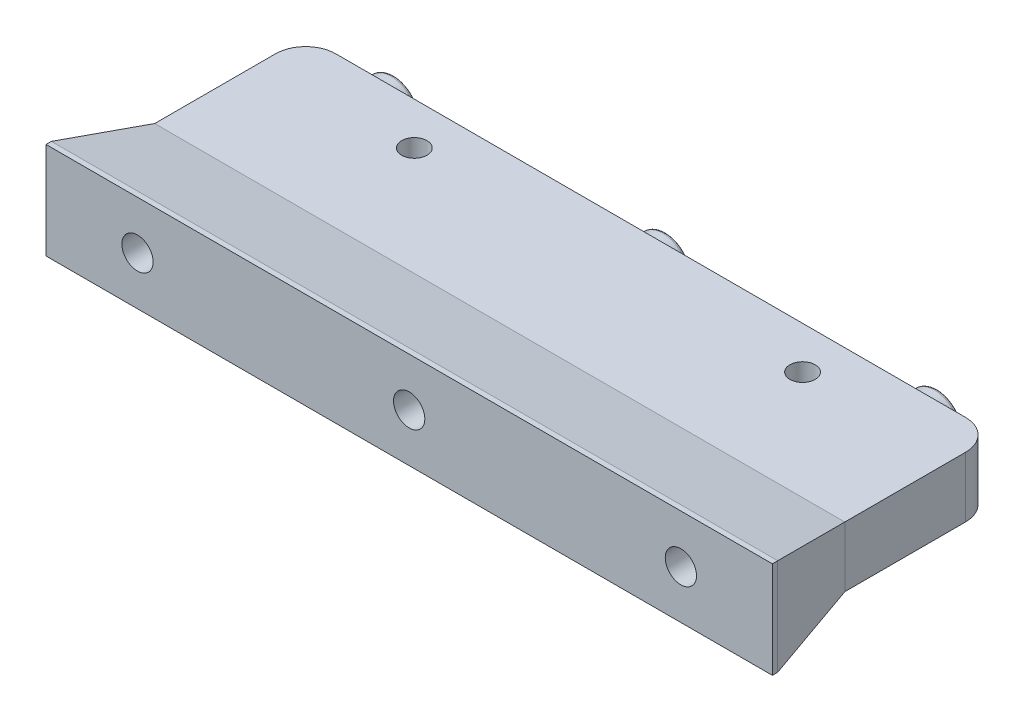
ISO-10303-21;
HEADER;
FILE_DESCRIPTION(('STEP AP214'),'2;1');
FILE_NAME('part.step','',(''),(''),'','','');
FILE_SCHEMA(('AUTOMOTIVE_DESIGN { 1 0 10303 214 1 1 1 1 }'));
ENDSEC;
DATA;
#1=APPLICATION_CONTEXT('core data for automotive mechanical design processes');
#2=APPLICATION_PROTOCOL_DEFINITION('international standard','automotive_design',2000,#1);
#3=PRODUCT_CONTEXT('',#1,'mechanical');
#4=PRODUCT('Part','Part','',(#3));
#5=PRODUCT_RELATED_PRODUCT_CATEGORY('part','',(#4));
#6=PRODUCT_DEFINITION_FORMATION('','',#4);
#7=PRODUCT_DEFINITION_CONTEXT('part definition',#1,'design');
#8=PRODUCT_DEFINITION('design','',#6,#7);
#9=PRODUCT_DEFINITION_SHAPE('','',#8);
#10=(LENGTH_UNIT() NAMED_UNIT(*) SI_UNIT(.MILLI.,.METRE.));
#11=(NAMED_UNIT(*) PLANE_ANGLE_UNIT() SI_UNIT($,.RADIAN.));
#12=(NAMED_UNIT(*) SI_UNIT($,.STERADIAN.) SOLID_ANGLE_UNIT());
#13=UNCERTAINTY_MEASURE_WITH_UNIT(LENGTH_MEASURE(1.E-05),#10,'distance_accuracy_value','');
#14=(GEOMETRIC_REPRESENTATION_CONTEXT(3) GLOBAL_UNCERTAINTY_ASSIGNED_CONTEXT((#13)) GLOBAL_UNIT_ASSIGNED_CONTEXT((#10,
#11,#12)) REPRESENTATION_CONTEXT('',''));
#15=CARTESIAN_POINT('',(0.,0.,0.));
#16=DIRECTION('',(0.,0.,1.));
#17=DIRECTION('',(1.,0.,0.));
#18=AXIS2_PLACEMENT_3D('',#15,#16,#17);
#19=CARTESIAN_POINT('',(57.15,-5.,-7.00000000000001));
#20=DIRECTION('',(0.,0.,-1.));
#21=DIRECTION('',(-1.,0.,0.));
#22=AXIS2_PLACEMENT_3D('',#19,#20,#21);
#23=PLANE('',#22);
#24=CARTESIAN_POINT('',(0.,0.,-7.00000000000001));
#25=DIRECTION('',(0.,0.,-1.));
#26=DIRECTION('',(-1.,0.,0.));
#27=AXIS2_PLACEMENT_3D('',#24,#25,#26);
#28=CIRCLE('',#27,4.85);
#29=CARTESIAN_POINT('',(-4.85,0.,-7.00000000000001));
#30=VERTEX_POINT('',#29);
#31=EDGE_CURVE('E233',#30,#30,#28,.F.);
#32=ORIENTED_EDGE('',*,*,#31,.T.);
#33=EDGE_LOOP('',(#32));
#34=FACE_BOUND('',#33,.T.);
#35=CARTESIAN_POINT('',(-45.,8.88178419700125E-13,-7.));
#36=DIRECTION('',(0.,0.,-1.));
#37=DIRECTION('',(-1.,0.,0.));
#38=AXIS2_PLACEMENT_3D('',#35,#36,#37);
#39=CIRCLE('',#38,4.85000000000001);
#40=CARTESIAN_POINT('',(-49.85,8.88178419700125E-13,-7.));
#41=VERTEX_POINT('',#40);
#42=EDGE_CURVE('E230',#41,#41,#39,.F.);
#43=ORIENTED_EDGE('',*,*,#42,.T.);
#44=EDGE_LOOP('',(#43));
#45=FACE_BOUND('',#44,.T.);
#46=CARTESIAN_POINT('',(45.,4.44089209850063E-13,-7.00000000000001));
#47=DIRECTION('',(0.,0.,-1.));
#48=DIRECTION('',(-1.,0.,0.));
#49=AXIS2_PLACEMENT_3D('',#46,#47,#48);
#50=CIRCLE('',#49,4.85);
#51=CARTESIAN_POINT('',(40.15,4.44089209850063E-13,-7.00000000000001));
#52=VERTEX_POINT('',#51);
#53=EDGE_CURVE('E227',#52,#52,#50,.F.);
#54=ORIENTED_EDGE('',*,*,#53,.T.);
#55=EDGE_LOOP('',(#54));
#56=FACE_BOUND('',#55,.T.);
#57=DIRECTION('',(-1.,0.,0.));
#58=VECTOR('',#57,1.);
#59=CARTESIAN_POINT('',(57.15,5.,-7.00000000000001));
#60=LINE('',#59,#58);
#61=CARTESIAN_POINT('',(52.15,5.,-7.00000000000001));
#62=VERTEX_POINT('',#61);
#63=CARTESIAN_POINT('',(-52.15,5.,-7.));
#64=VERTEX_POINT('',#63);
#65=EDGE_CURVE('E182',#62,#64,#60,.T.);
#66=ORIENTED_EDGE('',*,*,#65,.F.);
#67=DIRECTION('',(0.,1.,0.));
#68=VECTOR('',#67,1.);
#69=CARTESIAN_POINT('',(52.15,-5.,-7.00000000000001));
#70=LINE('',#69,#68);
#71=CARTESIAN_POINT('',(52.15,-5.,-7.00000000000001));
#72=VERTEX_POINT('',#71);
#73=EDGE_CURVE('E210',#62,#72,#70,.F.);
#74=ORIENTED_EDGE('',*,*,#73,.T.);
#75=DIRECTION('',(-1.,0.,0.));
#76=VECTOR('',#75,1.);
#77=CARTESIAN_POINT('',(57.15,-5.,-7.00000000000001));
#78=LINE('',#77,#76);
#79=CARTESIAN_POINT('',(-52.15,-5.,-7.));
#80=VERTEX_POINT('',#79);
#81=EDGE_CURVE('E190',#72,#80,#78,.T.);
#82=ORIENTED_EDGE('',*,*,#81,.T.);
#83=DIRECTION('',(0.,1.,0.));
#84=VECTOR('',#83,1.);
#85=CARTESIAN_POINT('',(-52.15,-5.,-7.));
#86=LINE('',#85,#84);
#87=EDGE_CURVE('E207',#80,#64,#86,.T.);
#88=ORIENTED_EDGE('',*,*,#87,.T.);
#89=EDGE_LOOP('',(#66,#74,#82,#88));
#90=FACE_BOUND('',#89,.T.);
#91=ADVANCED_FACE('F37',(#34,#45,#56,#90),#23,.T.);
#92=CARTESIAN_POINT('',(-57.15,-5.,-5.));
#93=DIRECTION('',(-1.,0.,0.));
#94=DIRECTION('',(0.,0.,1.));
#95=AXIS2_PLACEMENT_3D('',#92,#93,#94);
#96=PLANE('',#95);
#97=DIRECTION('',(0.,0.,1.));
#98=VECTOR('',#97,1.);
#99=CARTESIAN_POINT('',(-57.15,-5.,-7.));
#100=LINE('',#99,#98);
#101=CARTESIAN_POINT('',(-57.15,-5.,-2.));
#102=VERTEX_POINT('',#101);
#103=CARTESIAN_POINT('',(-57.15,-5.,18.));
#104=VERTEX_POINT('',#103);
#105=EDGE_CURVE('E193',#102,#104,#100,.T.);
#106=ORIENTED_EDGE('',*,*,#105,.T.);
#107=DIRECTION('',(0.,1.,0.));
#108=VECTOR('',#107,1.);
#109=CARTESIAN_POINT('',(-57.15,-5.,18.));
#110=LINE('',#109,#108);
#111=CARTESIAN_POINT('',(-57.15,5.,18.));
#112=VERTEX_POINT('',#111);
#113=EDGE_CURVE('E155',#104,#112,#110,.T.);
#114=ORIENTED_EDGE('',*,*,#113,.T.);
#115=DIRECTION('',(0.,0.,1.));
#116=VECTOR('',#115,1.);
#117=CARTESIAN_POINT('',(-57.15,5.,-7.));
#118=LINE('',#117,#116);
#119=CARTESIAN_POINT('',(-57.15,5.,-2.));
#120=VERTEX_POINT('',#119);
#121=EDGE_CURVE('E185',#120,#112,#118,.T.);
#122=ORIENTED_EDGE('',*,*,#121,.F.);
#123=DIRECTION('',(0.,1.,0.));
#124=VECTOR('',#123,1.);
#125=CARTESIAN_POINT('',(-57.15,-5.,-2.));
#126=LINE('',#125,#124);
#127=EDGE_CURVE('E217',#120,#102,#126,.F.);
#128=ORIENTED_EDGE('',*,*,#127,.T.);
#129=EDGE_LOOP('',(#106,#114,#122,#128));
#130=FACE_BOUND('',#129,.T.);
#131=ADVANCED_FACE('F308',(#130),#96,.T.);
#132=CARTESIAN_POINT('',(57.15,-5.,-7.00000000000001));
#133=DIRECTION('',(1.,0.,0.));
#134=DIRECTION('',(0.,0.,-1.));
#135=AXIS2_PLACEMENT_3D('',#132,#133,#134);
#136=PLANE('',#135);
#137=DIRECTION('',(0.,0.,-1.));
#138=VECTOR('',#137,1.);
#139=CARTESIAN_POINT('',(57.15,5.,-5.));
#140=LINE('',#139,#138);
#141=CARTESIAN_POINT('',(57.15,5.,18.));
#142=VERTEX_POINT('',#141);
#143=CARTESIAN_POINT('',(57.15,5.,-2.00000000000001));
#144=VERTEX_POINT('',#143);
#145=EDGE_CURVE('E180',#142,#144,#140,.T.);
#146=ORIENTED_EDGE('',*,*,#145,.F.);
#147=DIRECTION('',(0.,-1.,0.));
#148=VECTOR('',#147,1.);
#149=CARTESIAN_POINT('',(57.15,-5.,18.));
#150=LINE('',#149,#148);
#151=CARTESIAN_POINT('',(57.15,-5.,18.));
#152=VERTEX_POINT('',#151);
#153=EDGE_CURVE('E149',#142,#152,#150,.T.);
#154=ORIENTED_EDGE('',*,*,#153,.T.);
#155=DIRECTION('',(0.,0.,-1.));
#156=VECTOR('',#155,1.);
#157=CARTESIAN_POINT('',(57.15,-5.,-5.));
#158=LINE('',#157,#156);
#159=CARTESIAN_POINT('',(57.15,-5.,-2.00000000000001));
#160=VERTEX_POINT('',#159);
#161=EDGE_CURVE('E188',#152,#160,#158,.T.);
#162=ORIENTED_EDGE('',*,*,#161,.T.);
#163=DIRECTION('',(0.,1.,0.));
#164=VECTOR('',#163,1.);
#165=CARTESIAN_POINT('',(57.15,-5.,-2.00000000000001));
#166=LINE('',#165,#164);
#167=EDGE_CURVE('E196',#160,#144,#166,.T.);
#168=ORIENTED_EDGE('',*,*,#167,.T.);
#169=EDGE_LOOP('',(#146,#154,#162,#168));
#170=FACE_BOUND('',#169,.T.);
#171=ADVANCED_FACE('F314',(#170),#136,.T.);
#172=CARTESIAN_POINT('',(0.,-5.,0.));
#173=DIRECTION('',(0.,1.,0.));
#174=DIRECTION('',(0.,0.,1.));
#175=AXIS2_PLACEMENT_3D('',#172,#173,#174);
#176=PLANE('',#175);
#177=CARTESIAN_POINT('',(32.15,-5.,0.));
#178=DIRECTION('',(0.,-1.,0.));
#179=DIRECTION('',(0.,0.,-1.));
#180=AXIS2_PLACEMENT_3D('',#177,#178,#179);
#181=CIRCLE('',#180,4.7);
#182=CARTESIAN_POINT('',(32.15,-5.,-4.70000000000001));
#183=VERTEX_POINT('',#182);
#184=EDGE_CURVE('E170',#183,#183,#181,.T.);
#185=ORIENTED_EDGE('',*,*,#184,.F.);
#186=EDGE_LOOP('',(#185));
#187=FACE_BOUND('',#186,.T.);
#188=CARTESIAN_POINT('',(-32.15,-5.,0.));
#189=DIRECTION('',(0.,-1.,0.));
#190=DIRECTION('',(0.,0.,-1.));
#191=AXIS2_PLACEMENT_3D('',#188,#189,#190);
#192=CIRCLE('',#191,4.7);
#193=CARTESIAN_POINT('',(-32.15,-5.,-4.69999999999999));
#194=VERTEX_POINT('',#193);
#195=EDGE_CURVE('E163',#194,#194,#192,.T.);
#196=ORIENTED_EDGE('',*,*,#195,.F.);
#197=EDGE_LOOP('',(#196));
#198=FACE_BOUND('',#197,.T.);
#199=DIRECTION('',(1.,0.,0.));
#200=VECTOR('',#199,1.);
#201=CARTESIAN_POINT('',(0.,-5.,18.));
#202=LINE('',#201,#200);
#203=EDGE_CURVE('E157',#104,#152,#202,.T.);
#204=ORIENTED_EDGE('',*,*,#203,.F.);
#205=ORIENTED_EDGE('',*,*,#105,.F.);
#206=CARTESIAN_POINT('',(-52.15,-5.,-2.));
#207=DIRECTION('',(0.,1.,0.));
#208=DIRECTION('',(0.,0.,1.));
#209=AXIS2_PLACEMENT_3D('',#206,#207,#208);
#210=CIRCLE('',#209,5.);
#211=EDGE_CURVE('E212',#102,#80,#210,.F.);
#212=ORIENTED_EDGE('',*,*,#211,.T.);
#213=ORIENTED_EDGE('',*,*,#81,.F.);
#214=CARTESIAN_POINT('',(52.15,-5.,-2.00000000000001));
#215=DIRECTION('',(0.,1.,0.));
#216=DIRECTION('',(0.,0.,1.));
#217=AXIS2_PLACEMENT_3D('',#214,#215,#216);
#218=CIRCLE('',#217,5.);
#219=EDGE_CURVE('E214',#72,#160,#218,.F.);
#220=ORIENTED_EDGE('',*,*,#219,.T.);
#221=ORIENTED_EDGE('',*,*,#161,.F.);
#222=EDGE_LOOP('',(#204,#205,#212,#213,#220,#221));
#223=FACE_BOUND('',#222,.T.);
#224=ADVANCED_FACE('F320',(#187,#198,#223),#176,.F.);
#225=CARTESIAN_POINT('',(0.,5.,0.));
#226=DIRECTION('',(0.,1.,0.));
#227=DIRECTION('',(0.,0.,1.));
#228=AXIS2_PLACEMENT_3D('',#225,#226,#227);
#229=PLANE('',#228);
#230=CARTESIAN_POINT('',(-32.15,5.,0.));
#231=DIRECTION('',(0.,1.,0.));
#232=DIRECTION('',(0.,0.,1.));
#233=AXIS2_PLACEMENT_3D('',#230,#231,#232);
#234=CIRCLE('',#233,2.1);
#235=CARTESIAN_POINT('',(-32.15,5.,2.1));
#236=VERTEX_POINT('',#235);
#237=EDGE_CURVE('E177',#236,#236,#234,.T.);
#238=ORIENTED_EDGE('',*,*,#237,.F.);
#239=EDGE_LOOP('',(#238));
#240=FACE_BOUND('',#239,.T.);
#241=CARTESIAN_POINT('',(32.15,5.,0.));
#242=DIRECTION('',(0.,1.,0.));
#243=DIRECTION('',(0.,0.,-1.));
#244=AXIS2_PLACEMENT_3D('',#241,#242,#243);
#245=CIRCLE('',#244,2.1);
#246=CARTESIAN_POINT('',(32.15,5.,-2.1));
#247=VERTEX_POINT('',#246);
#248=EDGE_CURVE('E174',#247,#247,#245,.T.);
#249=ORIENTED_EDGE('',*,*,#248,.F.);
#250=EDGE_LOOP('',(#249));
#251=FACE_BOUND('',#250,.T.);
#252=ORIENTED_EDGE('',*,*,#121,.T.);
#253=DIRECTION('',(1.,0.,0.));
#254=VECTOR('',#253,1.);
#255=CARTESIAN_POINT('',(0.,5.,18.));
#256=LINE('',#255,#254);
#257=EDGE_CURVE('E219',#112,#142,#256,.T.);
#258=ORIENTED_EDGE('',*,*,#257,.T.);
#259=ORIENTED_EDGE('',*,*,#145,.T.);
#260=CARTESIAN_POINT('',(52.15,5.,-2.00000000000001));
#261=DIRECTION('',(0.,1.,0.));
#262=DIRECTION('',(0.,0.,1.));
#263=AXIS2_PLACEMENT_3D('',#260,#261,#262);
#264=CIRCLE('',#263,5.);
#265=EDGE_CURVE('E205',#144,#62,#264,.T.);
#266=ORIENTED_EDGE('',*,*,#265,.T.);
#267=ORIENTED_EDGE('',*,*,#65,.T.);
#268=CARTESIAN_POINT('',(-52.15,5.,-2.));
#269=DIRECTION('',(0.,1.,0.));
#270=DIRECTION('',(0.,0.,1.));
#271=AXIS2_PLACEMENT_3D('',#268,#269,#270);
#272=CIRCLE('',#271,5.);
#273=EDGE_CURVE('E203',#64,#120,#272,.T.);
#274=ORIENTED_EDGE('',*,*,#273,.T.);
#275=EDGE_LOOP('',(#252,#258,#259,#266,#267,#274));
#276=FACE_BOUND('',#275,.T.);
#277=ADVANCED_FACE('F383',(#240,#251,#276),#229,.T.);
#278=CARTESIAN_POINT('',(-32.15,-5.,0.));
#279=DIRECTION('',(0.,1.,0.));
#280=DIRECTION('',(0.,0.,1.));
#281=AXIS2_PLACEMENT_3D('',#278,#279,#280);
#282=CYLINDRICAL_SURFACE('',#281,2.1);
#283=CARTESIAN_POINT('',(-32.15,-2.55,0.));
#284=DIRECTION('',(0.,1.,0.));
#285=DIRECTION('',(0.,0.,1.));
#286=AXIS2_PLACEMENT_3D('',#283,#284,#285);
#287=CIRCLE('',#286,2.1);
#288=CARTESIAN_POINT('',(-32.15,-2.55,2.1));
#289=VERTEX_POINT('',#288);
#290=EDGE_CURVE('E166',#289,#289,#287,.F.);
#291=ORIENTED_EDGE('',*,*,#290,.T.);
#292=EDGE_LOOP('',(#291));
#293=FACE_BOUND('',#292,.T.);
#294=ORIENTED_EDGE('',*,*,#237,.T.);
#295=EDGE_LOOP('',(#294));
#296=FACE_BOUND('',#295,.T.);
#297=ADVANCED_FACE('F406',(#293,#296),#282,.F.);
#298=CARTESIAN_POINT('',(32.15,-5.,0.));
#299=DIRECTION('',(0.,1.,0.));
#300=DIRECTION('',(0.,0.,1.));
#301=AXIS2_PLACEMENT_3D('',#298,#299,#300);
#302=CYLINDRICAL_SURFACE('',#301,2.1);
#303=CARTESIAN_POINT('',(32.15,-2.55,0.));
#304=DIRECTION('',(0.,1.,0.));
#305=DIRECTION('',(0.,0.,1.));
#306=AXIS2_PLACEMENT_3D('',#303,#304,#305);
#307=CIRCLE('',#306,2.1);
#308=CARTESIAN_POINT('',(32.15,-2.55,2.09999999999999));
#309=VERTEX_POINT('',#308);
#310=EDGE_CURVE('E173',#309,#309,#307,.F.);
#311=ORIENTED_EDGE('',*,*,#310,.T.);
#312=EDGE_LOOP('',(#311));
#313=FACE_BOUND('',#312,.T.);
#314=ORIENTED_EDGE('',*,*,#248,.T.);
#315=EDGE_LOOP('',(#314));
#316=FACE_BOUND('',#315,.T.);
#317=ADVANCED_FACE('F414',(#313,#316),#302,.F.);
#318=CARTESIAN_POINT('',(34.4,-2.55,0.));
#319=DIRECTION('',(0.,1.,0.));
#320=DIRECTION('',(0.,0.,1.));
#321=AXIS2_PLACEMENT_3D('',#318,#319,#320);
#322=PLANE('',#321);
#323=CARTESIAN_POINT('',(32.15,-2.55,0.));
#324=DIRECTION('',(0.,-1.,0.));
#325=DIRECTION('',(0.,0.,-1.));
#326=AXIS2_PLACEMENT_3D('',#323,#324,#325);
#327=CIRCLE('',#326,2.25);
#328=CARTESIAN_POINT('',(32.15,-2.55,-2.25000000000001));
#329=VERTEX_POINT('',#328);
#330=EDGE_CURVE('E167',#329,#329,#327,.T.);
#331=ORIENTED_EDGE('',*,*,#330,.T.);
#332=EDGE_LOOP('',(#331));
#333=FACE_BOUND('',#332,.T.);
#334=ORIENTED_EDGE('',*,*,#310,.F.);
#335=EDGE_LOOP('',(#334));
#336=FACE_BOUND('',#335,.T.);
#337=ADVANCED_FACE('F417',(#333,#336),#322,.F.);
#338=CARTESIAN_POINT('',(32.15,-5.,0.));
#339=DIRECTION('',(0.,-1.,0.));
#340=DIRECTION('',(0.,0.,-1.));
#341=AXIS2_PLACEMENT_3D('',#338,#339,#340);
#342=CONICAL_SURFACE('',#341,4.7,0.785398163397448);
#343=ORIENTED_EDGE('',*,*,#330,.F.);
#344=EDGE_LOOP('',(#343));
#345=FACE_BOUND('',#344,.T.);
#346=ORIENTED_EDGE('',*,*,#184,.T.);
#347=EDGE_LOOP('',(#346));
#348=FACE_BOUND('',#347,.T.);
#349=ADVANCED_FACE('F420',(#345,#348),#342,.F.);
#350=CARTESIAN_POINT('',(-29.9,-2.55,0.));
#351=DIRECTION('',(0.,1.,0.));
#352=DIRECTION('',(0.,0.,1.));
#353=AXIS2_PLACEMENT_3D('',#350,#351,#352);
#354=PLANE('',#353);
#355=CARTESIAN_POINT('',(-32.15,-2.55,0.));
#356=DIRECTION('',(0.,-1.,0.));
#357=DIRECTION('',(0.,0.,-1.));
#358=AXIS2_PLACEMENT_3D('',#355,#356,#357);
#359=CIRCLE('',#358,2.25);
#360=CARTESIAN_POINT('',(-32.15,-2.55,-2.25));
#361=VERTEX_POINT('',#360);
#362=EDGE_CURVE('E160',#361,#361,#359,.T.);
#363=ORIENTED_EDGE('',*,*,#362,.T.);
#364=EDGE_LOOP('',(#363));
#365=FACE_BOUND('',#364,.T.);
#366=ORIENTED_EDGE('',*,*,#290,.F.);
#367=EDGE_LOOP('',(#366));
#368=FACE_BOUND('',#367,.T.);
#369=ADVANCED_FACE('F423',(#365,#368),#354,.F.);
#370=CARTESIAN_POINT('',(-32.15,-5.,0.));
#371=DIRECTION('',(0.,-1.,0.));
#372=DIRECTION('',(0.,0.,-1.));
#373=AXIS2_PLACEMENT_3D('',#370,#371,#372);
#374=CONICAL_SURFACE('',#373,4.7,0.785398163397448);
#375=ORIENTED_EDGE('',*,*,#362,.F.);
#376=EDGE_LOOP('',(#375));
#377=FACE_BOUND('',#376,.T.);
#378=ORIENTED_EDGE('',*,*,#195,.T.);
#379=EDGE_LOOP('',(#378));
#380=FACE_BOUND('',#379,.T.);
#381=ADVANCED_FACE('F326',(#377,#380),#374,.F.);
#382=CARTESIAN_POINT('',(52.15,-5.,-2.00000000000001));
#383=DIRECTION('',(0.,1.,0.));
#384=DIRECTION('',(0.,0.,1.));
#385=AXIS2_PLACEMENT_3D('',#382,#383,#384);
#386=CYLINDRICAL_SURFACE('',#385,5.);
#387=ORIENTED_EDGE('',*,*,#219,.F.);
#388=ORIENTED_EDGE('',*,*,#73,.F.);
#389=ORIENTED_EDGE('',*,*,#265,.F.);
#390=ORIENTED_EDGE('',*,*,#167,.F.);
#391=EDGE_LOOP('',(#387,#388,#389,#390));
#392=FACE_BOUND('',#391,.T.);
#393=ADVANCED_FACE('F322',(#392),#386,.T.);
#394=CARTESIAN_POINT('',(-52.15,-5.,-2.));
#395=DIRECTION('',(0.,1.,0.));
#396=DIRECTION('',(0.,0.,1.));
#397=AXIS2_PLACEMENT_3D('',#394,#395,#396);
#398=CYLINDRICAL_SURFACE('',#397,5.);
#399=ORIENTED_EDGE('',*,*,#211,.F.);
#400=ORIENTED_EDGE('',*,*,#127,.F.);
#401=ORIENTED_EDGE('',*,*,#273,.F.);
#402=ORIENTED_EDGE('',*,*,#87,.F.);
#403=EDGE_LOOP('',(#399,#400,#401,#402));
#404=FACE_BOUND('',#403,.T.);
#405=ADVANCED_FACE('F325',(#404),#398,.T.);
#406=CARTESIAN_POINT('',(-60.15,8.,18.));
#407=DIRECTION('',(-1.,0.,0.));
#408=DIRECTION('',(0.,0.,1.));
#409=AXIS2_PLACEMENT_3D('',#406,#407,#408);
#410=PLANE('',#409);
#411=DIRECTION('',(0.,0.,1.));
#412=VECTOR('',#411,1.);
#413=CARTESIAN_POINT('',(-60.15,8.,18.));
#414=LINE('',#413,#412);
#415=CARTESIAN_POINT('',(-60.15,8.,32.1138903284353));
#416=VERTEX_POINT('',#415);
#417=CARTESIAN_POINT('',(-60.15,8.,33.));
#418=VERTEX_POINT('',#417);
#419=EDGE_CURVE('E147',#416,#418,#414,.T.);
#420=ORIENTED_EDGE('',*,*,#419,.F.);
#421=DIRECTION('',(0.,-1.,0.));
#422=VECTOR('',#421,1.);
#423=CARTESIAN_POINT('',(-60.15,-8.,32.1138903284353));
#424=LINE('',#423,#422);
#425=CARTESIAN_POINT('',(-60.15,-8.,32.1138903284353));
#426=VERTEX_POINT('',#425);
#427=EDGE_CURVE('E47',#416,#426,#424,.T.);
#428=ORIENTED_EDGE('',*,*,#427,.T.);
#429=DIRECTION('',(0.,0.,1.));
#430=VECTOR('',#429,1.);
#431=CARTESIAN_POINT('',(-60.15,-8.,18.));
#432=LINE('',#431,#430);
#433=CARTESIAN_POINT('',(-60.15,-8.,33.));
#434=VERTEX_POINT('',#433);
#435=EDGE_CURVE('E114',#426,#434,#432,.T.);
#436=ORIENTED_EDGE('',*,*,#435,.T.);
#437=DIRECTION('',(0.,-1.,0.));
#438=VECTOR('',#437,1.);
#439=CARTESIAN_POINT('',(-60.15,8.,33.));
#440=LINE('',#439,#438);
#441=EDGE_CURVE('E118',#418,#434,#440,.T.);
#442=ORIENTED_EDGE('',*,*,#441,.F.);
#443=EDGE_LOOP('',(#420,#428,#436,#442));
#444=FACE_BOUND('',#443,.T.);
#445=ADVANCED_FACE('F116',(#444),#410,.T.);
#446=CARTESIAN_POINT('',(-60.15,8.,18.));
#447=DIRECTION('',(0.,1.,0.));
#448=DIRECTION('',(0.,0.,1.));
#449=AXIS2_PLACEMENT_3D('',#446,#447,#448);
#450=PLANE('',#449);
#451=DIRECTION('',(0.,0.,1.));
#452=VECTOR('',#451,1.);
#453=CARTESIAN_POINT('',(60.15,8.,18.));
#454=LINE('',#453,#452);
#455=CARTESIAN_POINT('',(60.15,8.,32.1138903284353));
#456=VERTEX_POINT('',#455);
#457=CARTESIAN_POINT('',(60.15,8.,33.));
#458=VERTEX_POINT('',#457);
#459=EDGE_CURVE('E150',#456,#458,#454,.T.);
#460=ORIENTED_EDGE('',*,*,#459,.F.);
#461=DIRECTION('',(-1.,0.,0.));
#462=VECTOR('',#461,1.);
#463=CARTESIAN_POINT('',(-60.15,8.,32.1138903284353));
#464=LINE('',#463,#462);
#465=EDGE_CURVE('E62',#456,#416,#464,.T.);
#466=ORIENTED_EDGE('',*,*,#465,.T.);
#467=ORIENTED_EDGE('',*,*,#419,.T.);
#468=DIRECTION('',(-1.,0.,0.));
#469=VECTOR('',#468,1.);
#470=CARTESIAN_POINT('',(-60.15,8.,33.));
#471=LINE('',#470,#469);
#472=EDGE_CURVE('E123',#458,#418,#471,.T.);
#473=ORIENTED_EDGE('',*,*,#472,.F.);
#474=EDGE_LOOP('',(#460,#466,#467,#473));
#475=FACE_BOUND('',#474,.T.);
#476=ADVANCED_FACE('F435',(#475),#450,.T.);
#477=CARTESIAN_POINT('',(60.15,8.,18.));
#478=DIRECTION('',(1.,0.,0.));
#479=DIRECTION('',(0.,0.,-1.));
#480=AXIS2_PLACEMENT_3D('',#477,#478,#479);
#481=PLANE('',#480);
#482=DIRECTION('',(0.,0.,1.));
#483=VECTOR('',#482,1.);
#484=CARTESIAN_POINT('',(60.15,-8.,18.));
#485=LINE('',#484,#483);
#486=CARTESIAN_POINT('',(60.15,-8.,32.1138903284353));
#487=VERTEX_POINT('',#486);
#488=CARTESIAN_POINT('',(60.15,-8.,33.));
#489=VERTEX_POINT('',#488);
#490=EDGE_CURVE('E122',#487,#489,#485,.T.);
#491=ORIENTED_EDGE('',*,*,#490,.F.);
#492=DIRECTION('',(0.,1.,0.));
#493=VECTOR('',#492,1.);
#494=CARTESIAN_POINT('',(60.15,8.,32.1138903284353));
#495=LINE('',#494,#493);
#496=EDGE_CURVE('E257',#487,#456,#495,.T.);
#497=ORIENTED_EDGE('',*,*,#496,.T.);
#498=ORIENTED_EDGE('',*,*,#459,.T.);
#499=DIRECTION('',(0.,1.,0.));
#500=VECTOR('',#499,1.);
#501=CARTESIAN_POINT('',(60.15,8.,33.));
#502=LINE('',#501,#500);
#503=EDGE_CURVE('E132',#489,#458,#502,.T.);
#504=ORIENTED_EDGE('',*,*,#503,.F.);
#505=EDGE_LOOP('',(#491,#497,#498,#504));
#506=FACE_BOUND('',#505,.T.);
#507=ADVANCED_FACE('F301',(#506),#481,.T.);
#508=CARTESIAN_POINT('',(-60.15,-8.,18.));
#509=DIRECTION('',(0.,-1.,0.));
#510=DIRECTION('',(0.,0.,-1.));
#511=AXIS2_PLACEMENT_3D('',#508,#509,#510);
#512=PLANE('',#511);
#513=ORIENTED_EDGE('',*,*,#435,.F.);
#514=DIRECTION('',(1.,0.,0.));
#515=VECTOR('',#514,1.);
#516=CARTESIAN_POINT('',(60.15,-8.,32.1138903284353));
#517=LINE('',#516,#515);
#518=EDGE_CURVE('E11',#426,#487,#517,.T.);
#519=ORIENTED_EDGE('',*,*,#518,.T.);
#520=ORIENTED_EDGE('',*,*,#490,.T.);
#521=DIRECTION('',(1.,0.,0.));
#522=VECTOR('',#521,1.);
#523=CARTESIAN_POINT('',(-60.15,-8.,33.));
#524=LINE('',#523,#522);
#525=EDGE_CURVE('E126',#434,#489,#524,.T.);
#526=ORIENTED_EDGE('',*,*,#525,.F.);
#527=EDGE_LOOP('',(#513,#519,#520,#526));
#528=FACE_BOUND('',#527,.T.);
#529=ADVANCED_FACE('F127',(#528),#512,.T.);
#530=CARTESIAN_POINT('',(-57.15,-5.,33.));
#531=DIRECTION('',(0.,0.,1.));
#532=DIRECTION('',(1.,0.,0.));
#533=AXIS2_PLACEMENT_3D('',#530,#531,#532);
#534=PLANE('',#533);
#535=CARTESIAN_POINT('',(-45.,0.,33.));
#536=DIRECTION('',(0.,0.,1.));
#537=DIRECTION('',(1.,0.,0.));
#538=AXIS2_PLACEMENT_3D('',#535,#536,#537);
#539=CIRCLE('',#538,2.59);
#540=CARTESIAN_POINT('',(-42.41,0.,33.));
#541=VERTEX_POINT('',#540);
#542=EDGE_CURVE('E136',#541,#541,#539,.T.);
#543=ORIENTED_EDGE('',*,*,#542,.F.);
#544=EDGE_LOOP('',(#543));
#545=FACE_BOUND('',#544,.T.);
#546=CARTESIAN_POINT('',(45.,4.44089209850063E-13,33.));
#547=DIRECTION('',(0.,0.,1.));
#548=DIRECTION('',(-1.,0.,0.));
#549=AXIS2_PLACEMENT_3D('',#546,#547,#548);
#550=CIRCLE('',#549,2.59000000000001);
#551=CARTESIAN_POINT('',(42.41,4.44089209850063E-13,33.));
#552=VERTEX_POINT('',#551);
#553=EDGE_CURVE('E139',#552,#552,#550,.T.);
#554=ORIENTED_EDGE('',*,*,#553,.F.);
#555=EDGE_LOOP('',(#554));
#556=FACE_BOUND('',#555,.T.);
#557=CARTESIAN_POINT('',(0.,0.,33.));
#558=DIRECTION('',(0.,0.,1.));
#559=DIRECTION('',(1.,0.,0.));
#560=AXIS2_PLACEMENT_3D('',#557,#558,#559);
#561=CIRCLE('',#560,2.59);
#562=CARTESIAN_POINT('',(2.59,0.,33.));
#563=VERTEX_POINT('',#562);
#564=EDGE_CURVE('E142',#563,#563,#561,.T.);
#565=ORIENTED_EDGE('',*,*,#564,.F.);
#566=EDGE_LOOP('',(#565));
#567=FACE_BOUND('',#566,.T.);
#568=ORIENTED_EDGE('',*,*,#441,.T.);
#569=ORIENTED_EDGE('',*,*,#525,.T.);
#570=ORIENTED_EDGE('',*,*,#503,.T.);
#571=ORIENTED_EDGE('',*,*,#472,.T.);
#572=EDGE_LOOP('',(#568,#569,#570,#571));
#573=FACE_BOUND('',#572,.T.);
#574=ADVANCED_FACE('F134',(#545,#556,#567,#573),#534,.T.);
#575=CARTESIAN_POINT('',(0.,0.,-7.00000000000001));
#576=DIRECTION('',(0.,0.,1.));
#577=DIRECTION('',(1.,0.,0.));
#578=AXIS2_PLACEMENT_3D('',#575,#576,#577);
#579=CYLINDRICAL_SURFACE('',#578,2.59);
#580=ORIENTED_EDGE('',*,*,#564,.T.);
#581=EDGE_LOOP('',(#580));
#582=FACE_BOUND('',#581,.T.);
#583=CARTESIAN_POINT('',(0.,0.,-9.50000000000001));
#584=DIRECTION('',(0.,0.,-1.));
#585=DIRECTION('',(-1.,0.,0.));
#586=AXIS2_PLACEMENT_3D('',#583,#584,#585);
#587=CIRCLE('',#586,2.59);
#588=CARTESIAN_POINT('',(-2.59,0.,-9.50000000000001));
#589=VERTEX_POINT('',#588);
#590=EDGE_CURVE('E271',#589,#589,#587,.T.);
#591=ORIENTED_EDGE('',*,*,#590,.T.);
#592=EDGE_LOOP('',(#591));
#593=FACE_BOUND('',#592,.T.);
#594=ADVANCED_FACE('F290',(#582,#593),#579,.F.);
#595=CARTESIAN_POINT('',(45.,4.44089209850063E-13,-7.00000000000001));
#596=DIRECTION('',(0.,0.,1.));
#597=DIRECTION('',(1.,0.,0.));
#598=AXIS2_PLACEMENT_3D('',#595,#596,#597);
#599=CYLINDRICAL_SURFACE('',#598,2.59000000000001);
#600=ORIENTED_EDGE('',*,*,#553,.T.);
#601=EDGE_LOOP('',(#600));
#602=FACE_BOUND('',#601,.T.);
#603=CARTESIAN_POINT('',(45.,4.44089209850063E-13,-9.50000000000001));
#604=DIRECTION('',(0.,0.,-1.));
#605=DIRECTION('',(-1.,0.,0.));
#606=AXIS2_PLACEMENT_3D('',#603,#604,#605);
#607=CIRCLE('',#606,2.59000000000001);
#608=CARTESIAN_POINT('',(42.41,4.44089209850063E-13,-9.50000000000001));
#609=VERTEX_POINT('',#608);
#610=EDGE_CURVE('E280',#609,#609,#607,.T.);
#611=ORIENTED_EDGE('',*,*,#610,.T.);
#612=EDGE_LOOP('',(#611));
#613=FACE_BOUND('',#612,.T.);
#614=ADVANCED_FACE('F299',(#602,#613),#599,.F.);
#615=CARTESIAN_POINT('',(-45.,0.,-7.00000000000001));
#616=DIRECTION('',(0.,0.,1.));
#617=DIRECTION('',(1.,0.,0.));
#618=AXIS2_PLACEMENT_3D('',#615,#616,#617);
#619=CYLINDRICAL_SURFACE('',#618,2.59);
#620=ORIENTED_EDGE('',*,*,#542,.T.);
#621=EDGE_LOOP('',(#620));
#622=FACE_BOUND('',#621,.T.);
#623=CARTESIAN_POINT('',(-45.,8.88178419700125E-13,-9.5));
#624=DIRECTION('',(0.,0.,-1.));
#625=DIRECTION('',(1.,0.,0.));
#626=AXIS2_PLACEMENT_3D('',#623,#624,#625);
#627=CIRCLE('',#626,2.59000000000003);
#628=CARTESIAN_POINT('',(-42.41,8.88178419700125E-13,-9.5));
#629=VERTEX_POINT('',#628);
#630=EDGE_CURVE('E275',#629,#629,#627,.T.);
#631=ORIENTED_EDGE('',*,*,#630,.T.);
#632=EDGE_LOOP('',(#631));
#633=FACE_BOUND('',#632,.T.);
#634=ADVANCED_FACE('F444',(#622,#633),#619,.F.);
#635=CARTESIAN_POINT('',(45.,4.44089209850063E-13,-9.50000000000001));
#636=DIRECTION('',(0.,0.,-1.));
#637=DIRECTION('',(-1.,0.,0.));
#638=AXIS2_PLACEMENT_3D('',#635,#636,#637);
#639=PLANE('',#638);
#640=CARTESIAN_POINT('',(45.,4.44089209850063E-13,-9.50000000000001));
#641=DIRECTION('',(0.,0.,-1.));
#642=DIRECTION('',(-1.,0.,0.));
#643=AXIS2_PLACEMENT_3D('',#640,#641,#642);
#644=CIRCLE('',#643,3.85);
#645=CARTESIAN_POINT('',(41.15,4.44089209850063E-13,-9.50000000000001));
#646=VERTEX_POINT('',#645);
#647=EDGE_CURVE('E254',#646,#646,#644,.T.);
#648=ORIENTED_EDGE('',*,*,#647,.T.);
#649=EDGE_LOOP('',(#648));
#650=FACE_BOUND('',#649,.T.);
#651=ORIENTED_EDGE('',*,*,#610,.F.);
#652=EDGE_LOOP('',(#651));
#653=FACE_BOUND('',#652,.T.);
#654=ADVANCED_FACE('F447',(#650,#653),#639,.T.);
#655=CARTESIAN_POINT('',(45.,4.44089209850063E-13,-9.50000000000001));
#656=DIRECTION('',(0.,0.,1.));
#657=DIRECTION('',(1.,0.,0.));
#658=AXIS2_PLACEMENT_3D('',#655,#656,#657);
#659=CYLINDRICAL_SURFACE('',#658,4.35);
#660=CARTESIAN_POINT('',(45.,4.44089209850063E-13,-7.50000000000001));
#661=DIRECTION('',(0.,0.,-1.));
#662=DIRECTION('',(-1.,0.,0.));
#663=AXIS2_PLACEMENT_3D('',#660,#661,#662);
#664=CIRCLE('',#663,4.35);
#665=CARTESIAN_POINT('',(40.65,4.44089209850063E-13,-7.50000000000001));
#666=VERTEX_POINT('',#665);
#667=EDGE_CURVE('E251',#666,#666,#664,.T.);
#668=ORIENTED_EDGE('',*,*,#667,.T.);
#669=EDGE_LOOP('',(#668));
#670=FACE_BOUND('',#669,.T.);
#671=CARTESIAN_POINT('',(45.,4.44089209850063E-13,-9.00000000000001));
#672=DIRECTION('',(0.,0.,-1.));
#673=DIRECTION('',(-1.,0.,0.));
#674=AXIS2_PLACEMENT_3D('',#671,#672,#673);
#675=CIRCLE('',#674,4.35);
#676=CARTESIAN_POINT('',(40.65,4.44089209850063E-13,-9.00000000000001));
#677=VERTEX_POINT('',#676);
#678=EDGE_CURVE('E248',#677,#677,#675,.F.);
#679=ORIENTED_EDGE('',*,*,#678,.T.);
#680=EDGE_LOOP('',(#679));
#681=FACE_BOUND('',#680,.T.);
#682=ADVANCED_FACE('F449',(#670,#681),#659,.T.);
#683=CARTESIAN_POINT('',(-45.,8.88178419700125E-13,-9.5));
#684=DIRECTION('',(0.,0.,1.));
#685=DIRECTION('',(1.,0.,0.));
#686=AXIS2_PLACEMENT_3D('',#683,#684,#685);
#687=PLANE('',#686);
#688=CARTESIAN_POINT('',(-45.,8.88178419700125E-13,-9.5));
#689=DIRECTION('',(0.,0.,1.));
#690=DIRECTION('',(1.,0.,0.));
#691=AXIS2_PLACEMENT_3D('',#688,#689,#690);
#692=CIRCLE('',#691,3.85000000000001);
#693=CARTESIAN_POINT('',(-41.15,8.88178419700125E-13,-9.5));
#694=VERTEX_POINT('',#693);
#695=EDGE_CURVE('E245',#694,#694,#692,.F.);
#696=ORIENTED_EDGE('',*,*,#695,.T.);
#697=EDGE_LOOP('',(#696));
#698=FACE_BOUND('',#697,.T.);
#699=ORIENTED_EDGE('',*,*,#630,.F.);
#700=EDGE_LOOP('',(#699));
#701=FACE_BOUND('',#700,.T.);
#702=ADVANCED_FACE('F452',(#698,#701),#687,.F.);
#703=CARTESIAN_POINT('',(-45.,8.88178419700125E-13,-9.5));
#704=DIRECTION('',(0.,0.,1.));
#705=DIRECTION('',(1.,0.,0.));
#706=AXIS2_PLACEMENT_3D('',#703,#704,#705);
#707=CYLINDRICAL_SURFACE('',#706,4.35000000000001);
#708=CARTESIAN_POINT('',(-45.,8.88178419700125E-13,-7.5));
#709=DIRECTION('',(0.,0.,-1.));
#710=DIRECTION('',(-1.,0.,0.));
#711=AXIS2_PLACEMENT_3D('',#708,#709,#710);
#712=CIRCLE('',#711,4.35000000000001);
#713=CARTESIAN_POINT('',(-49.35,8.88178419700125E-13,-7.5));
#714=VERTEX_POINT('',#713);
#715=EDGE_CURVE('E242',#714,#714,#712,.T.);
#716=ORIENTED_EDGE('',*,*,#715,.T.);
#717=EDGE_LOOP('',(#716));
#718=FACE_BOUND('',#717,.T.);
#719=CARTESIAN_POINT('',(-45.,8.88178419700125E-13,-9.));
#720=DIRECTION('',(0.,0.,1.));
#721=DIRECTION('',(1.,0.,0.));
#722=AXIS2_PLACEMENT_3D('',#719,#720,#721);
#723=CIRCLE('',#722,4.35000000000001);
#724=CARTESIAN_POINT('',(-40.65,8.88178419700125E-13,-9.));
#725=VERTEX_POINT('',#724);
#726=EDGE_CURVE('E239',#725,#725,#723,.T.);
#727=ORIENTED_EDGE('',*,*,#726,.T.);
#728=EDGE_LOOP('',(#727));
#729=FACE_BOUND('',#728,.T.);
#730=ADVANCED_FACE('F457',(#718,#729),#707,.T.);
#731=CARTESIAN_POINT('',(0.,0.,-9.50000000000001));
#732=DIRECTION('',(0.,0.,-1.));
#733=DIRECTION('',(-1.,0.,0.));
#734=AXIS2_PLACEMENT_3D('',#731,#732,#733);
#735=PLANE('',#734);
#736=CARTESIAN_POINT('',(0.,0.,-9.50000000000001));
#737=DIRECTION('',(0.,0.,-1.));
#738=DIRECTION('',(-1.,0.,0.));
#739=AXIS2_PLACEMENT_3D('',#736,#737,#738);
#740=CIRCLE('',#739,3.85);
#741=CARTESIAN_POINT('',(-3.85,0.,-9.50000000000001));
#742=VERTEX_POINT('',#741);
#743=EDGE_CURVE('E236',#742,#742,#740,.T.);
#744=ORIENTED_EDGE('',*,*,#743,.T.);
#745=EDGE_LOOP('',(#744));
#746=FACE_BOUND('',#745,.T.);
#747=ORIENTED_EDGE('',*,*,#590,.F.);
#748=EDGE_LOOP('',(#747));
#749=FACE_BOUND('',#748,.T.);
#750=ADVANCED_FACE('F460',(#746,#749),#735,.T.);
#751=CARTESIAN_POINT('',(0.,0.,-9.50000000000001));
#752=DIRECTION('',(0.,0.,1.));
#753=DIRECTION('',(1.,0.,0.));
#754=AXIS2_PLACEMENT_3D('',#751,#752,#753);
#755=CYLINDRICAL_SURFACE('',#754,4.35);
#756=CARTESIAN_POINT('',(0.,0.,-7.50000000000001));
#757=DIRECTION('',(0.,0.,-1.));
#758=DIRECTION('',(-1.,0.,0.));
#759=AXIS2_PLACEMENT_3D('',#756,#757,#758);
#760=CIRCLE('',#759,4.35);
#761=CARTESIAN_POINT('',(-4.35,0.,-7.5));
#762=VERTEX_POINT('',#761);
#763=EDGE_CURVE('E224',#762,#762,#760,.T.);
#764=ORIENTED_EDGE('',*,*,#763,.T.);
#765=EDGE_LOOP('',(#764));
#766=FACE_BOUND('',#765,.T.);
#767=CARTESIAN_POINT('',(0.,0.,-9.00000000000001));
#768=DIRECTION('',(0.,0.,-1.));
#769=DIRECTION('',(-1.,0.,0.));
#770=AXIS2_PLACEMENT_3D('',#767,#768,#769);
#771=CIRCLE('',#770,4.35);
#772=CARTESIAN_POINT('',(-4.35,0.,-9.00000000000001));
#773=VERTEX_POINT('',#772);
#774=EDGE_CURVE('E221',#773,#773,#771,.F.);
#775=ORIENTED_EDGE('',*,*,#774,.T.);
#776=EDGE_LOOP('',(#775));
#777=FACE_BOUND('',#776,.T.);
#778=ADVANCED_FACE('F335',(#766,#777),#755,.T.);
#779=CARTESIAN_POINT('',(0.,0.,-7.50000000000001));
#780=DIRECTION('',(0.,0.,-1.));
#781=DIRECTION('',(-1.,0.,0.));
#782=AXIS2_PLACEMENT_3D('',#779,#780,#781);
#783=TOROIDAL_SURFACE('',#782,4.85,0.5);
#784=ORIENTED_EDGE('',*,*,#31,.F.);
#785=EDGE_LOOP('',(#784));
#786=FACE_BOUND('',#785,.T.);
#787=ORIENTED_EDGE('',*,*,#763,.F.);
#788=EDGE_LOOP('',(#787));
#789=FACE_BOUND('',#788,.T.);
#790=ADVANCED_FACE('F331',(#786,#789),#783,.F.);
#791=CARTESIAN_POINT('',(0.,0.,-9.00000000000001));
#792=DIRECTION('',(0.,0.,-1.));
#793=DIRECTION('',(-1.,0.,0.));
#794=AXIS2_PLACEMENT_3D('',#791,#792,#793);
#795=TOROIDAL_SURFACE('',#794,3.85,0.5);
#796=ORIENTED_EDGE('',*,*,#774,.F.);
#797=EDGE_LOOP('',(#796));
#798=FACE_BOUND('',#797,.T.);
#799=ORIENTED_EDGE('',*,*,#743,.F.);
#800=EDGE_LOOP('',(#799));
#801=FACE_BOUND('',#800,.T.);
#802=ADVANCED_FACE('F334',(#798,#801),#795,.T.);
#803=CARTESIAN_POINT('',(-45.,8.88178419700125E-13,-7.5));
#804=DIRECTION('',(0.,0.,-1.));
#805=DIRECTION('',(-1.,0.,0.));
#806=AXIS2_PLACEMENT_3D('',#803,#804,#805);
#807=TOROIDAL_SURFACE('',#806,4.85000000000001,0.5);
#808=ORIENTED_EDGE('',*,*,#42,.F.);
#809=EDGE_LOOP('',(#808));
#810=FACE_BOUND('',#809,.T.);
#811=ORIENTED_EDGE('',*,*,#715,.F.);
#812=EDGE_LOOP('',(#811));
#813=FACE_BOUND('',#812,.T.);
#814=ADVANCED_FACE('F339',(#810,#813),#807,.F.);
#815=CARTESIAN_POINT('',(-45.,8.88178419700125E-13,-9.));
#816=DIRECTION('',(0.,0.,1.));
#817=DIRECTION('',(1.,0.,0.));
#818=AXIS2_PLACEMENT_3D('',#815,#816,#817);
#819=TOROIDAL_SURFACE('',#818,3.85000000000001,0.5);
#820=ORIENTED_EDGE('',*,*,#726,.F.);
#821=EDGE_LOOP('',(#820));
#822=FACE_BOUND('',#821,.T.);
#823=ORIENTED_EDGE('',*,*,#695,.F.);
#824=EDGE_LOOP('',(#823));
#825=FACE_BOUND('',#824,.T.);
#826=ADVANCED_FACE('F343',(#822,#825),#819,.T.);
#827=CARTESIAN_POINT('',(45.,4.44089209850063E-13,-7.50000000000001));
#828=DIRECTION('',(0.,0.,-1.));
#829=DIRECTION('',(-1.,0.,0.));
#830=AXIS2_PLACEMENT_3D('',#827,#828,#829);
#831=TOROIDAL_SURFACE('',#830,4.85,0.5);
#832=ORIENTED_EDGE('',*,*,#53,.F.);
#833=EDGE_LOOP('',(#832));
#834=FACE_BOUND('',#833,.T.);
#835=ORIENTED_EDGE('',*,*,#667,.F.);
#836=EDGE_LOOP('',(#835));
#837=FACE_BOUND('',#836,.T.);
#838=ADVANCED_FACE('F347',(#834,#837),#831,.F.);
#839=CARTESIAN_POINT('',(45.,4.44089209850063E-13,-9.00000000000001));
#840=DIRECTION('',(0.,0.,-1.));
#841=DIRECTION('',(-1.,0.,0.));
#842=AXIS2_PLACEMENT_3D('',#839,#840,#841);
#843=TOROIDAL_SURFACE('',#842,3.85,0.5);
#844=ORIENTED_EDGE('',*,*,#678,.F.);
#845=EDGE_LOOP('',(#844));
#846=FACE_BOUND('',#845,.T.);
#847=ORIENTED_EDGE('',*,*,#647,.F.);
#848=EDGE_LOOP('',(#847));
#849=FACE_BOUND('',#848,.T.);
#850=ADVANCED_FACE('F351',(#846,#849),#843,.T.);
#851=CARTESIAN_POINT('',(-60.15,8.,32.1138903284353));
#852=DIRECTION('',(-0.978147600733805,0.,-0.20791169081776));
#853=DIRECTION('',(0.,1.,0.));
#854=AXIS2_PLACEMENT_3D('',#851,#852,#853);
#855=PLANE('',#854);
#856=DIRECTION('',(0.20355859495278,-0.20355859495278,-0.957667894857972));
#857=VECTOR('',#856,1.);
#858=CARTESIAN_POINT('',(-60.15,8.,32.1138903284353));
#859=LINE('',#858,#857);
#860=EDGE_CURVE('E265',#112,#416,#859,.F.);
#861=ORIENTED_EDGE('',*,*,#860,.F.);
#862=ORIENTED_EDGE('',*,*,#113,.F.);
#863=DIRECTION('',(0.20355859495278,0.20355859495278,-0.957667894857972));
#864=VECTOR('',#863,1.);
#865=CARTESIAN_POINT('',(-60.15,-8.,32.1138903284353));
#866=LINE('',#865,#864);
#867=EDGE_CURVE('E42',#426,#104,#866,.T.);
#868=ORIENTED_EDGE('',*,*,#867,.F.);
#869=ORIENTED_EDGE('',*,*,#427,.F.);
#870=EDGE_LOOP('',(#861,#862,#868,#869));
#871=FACE_BOUND('',#870,.T.);
#872=ADVANCED_FACE('F40',(#871),#855,.T.);
#873=CARTESIAN_POINT('',(-60.15,-8.,32.1138903284353));
#874=DIRECTION('',(0.,-0.978147600733805,-0.20791169081776));
#875=DIRECTION('',(-1.,0.,0.));
#876=AXIS2_PLACEMENT_3D('',#873,#874,#875);
#877=PLANE('',#876);
#878=ORIENTED_EDGE('',*,*,#867,.T.);
#879=ORIENTED_EDGE('',*,*,#203,.T.);
#880=DIRECTION('',(0.20355859495278,-0.20355859495278,0.957667894857972));
#881=VECTOR('',#880,1.);
#882=CARTESIAN_POINT('',(55.1652369800283,-3.01523698002826,8.66242413606164));
#883=LINE('',#882,#881);
#884=EDGE_CURVE('E264',#487,#152,#883,.F.);
#885=ORIENTED_EDGE('',*,*,#884,.F.);
#886=ORIENTED_EDGE('',*,*,#518,.F.);
#887=EDGE_LOOP('',(#878,#879,#885,#886));
#888=FACE_BOUND('',#887,.T.);
#889=ADVANCED_FACE('F369',(#888),#877,.T.);
#890=CARTESIAN_POINT('',(-60.15,8.,32.1138903284353));
#891=DIRECTION('',(0.,0.978147600733805,-0.20791169081776));
#892=DIRECTION('',(1.,0.,0.));
#893=AXIS2_PLACEMENT_3D('',#890,#891,#892);
#894=PLANE('',#893);
#895=ORIENTED_EDGE('',*,*,#860,.T.);
#896=ORIENTED_EDGE('',*,*,#465,.F.);
#897=DIRECTION('',(-0.20355859495278,-0.20355859495278,-0.957667894857972));
#898=VECTOR('',#897,1.);
#899=CARTESIAN_POINT('',(55.1652369800283,3.01523698002826,8.66242413606164));
#900=LINE('',#899,#898);
#901=EDGE_CURVE('E262',#142,#456,#900,.F.);
#902=ORIENTED_EDGE('',*,*,#901,.F.);
#903=ORIENTED_EDGE('',*,*,#257,.F.);
#904=EDGE_LOOP('',(#895,#896,#902,#903));
#905=FACE_BOUND('',#904,.T.);
#906=ADVANCED_FACE('F363',(#905),#894,.T.);
#907=CARTESIAN_POINT('',(60.15,8.,32.1138903284353));
#908=DIRECTION('',(0.978147600733805,0.,-0.20791169081776));
#909=DIRECTION('',(0.,-1.,0.));
#910=AXIS2_PLACEMENT_3D('',#907,#908,#909);
#911=PLANE('',#910);
#912=ORIENTED_EDGE('',*,*,#884,.T.);
#913=ORIENTED_EDGE('',*,*,#153,.F.);
#914=ORIENTED_EDGE('',*,*,#901,.T.);
#915=ORIENTED_EDGE('',*,*,#496,.F.);
#916=EDGE_LOOP('',(#912,#913,#914,#915));
#917=FACE_BOUND('',#916,.T.);
#918=ADVANCED_FACE('F357',(#917),#911,.T.);
#919=CLOSED_SHELL('',(#91,#131,#171,#224,#277,#297,#317,#337,#349,#369,#381,#393,#405,#445,#476,
#507,#529,#574,#594,#614,#634,#654,#682,#702,#730,#750,#778,#790,#802,#814,#826,#838,#850,#872,
#889,#906,#918));
#920=MANIFOLD_SOLID_BREP('B2',#919);
#921=ADVANCED_BREP_SHAPE_REPRESENTATION('',(#18,#920),#14);
#922=SHAPE_DEFINITION_REPRESENTATION(#9,#921);
ENDSEC;
END-ISO-10303-21;
